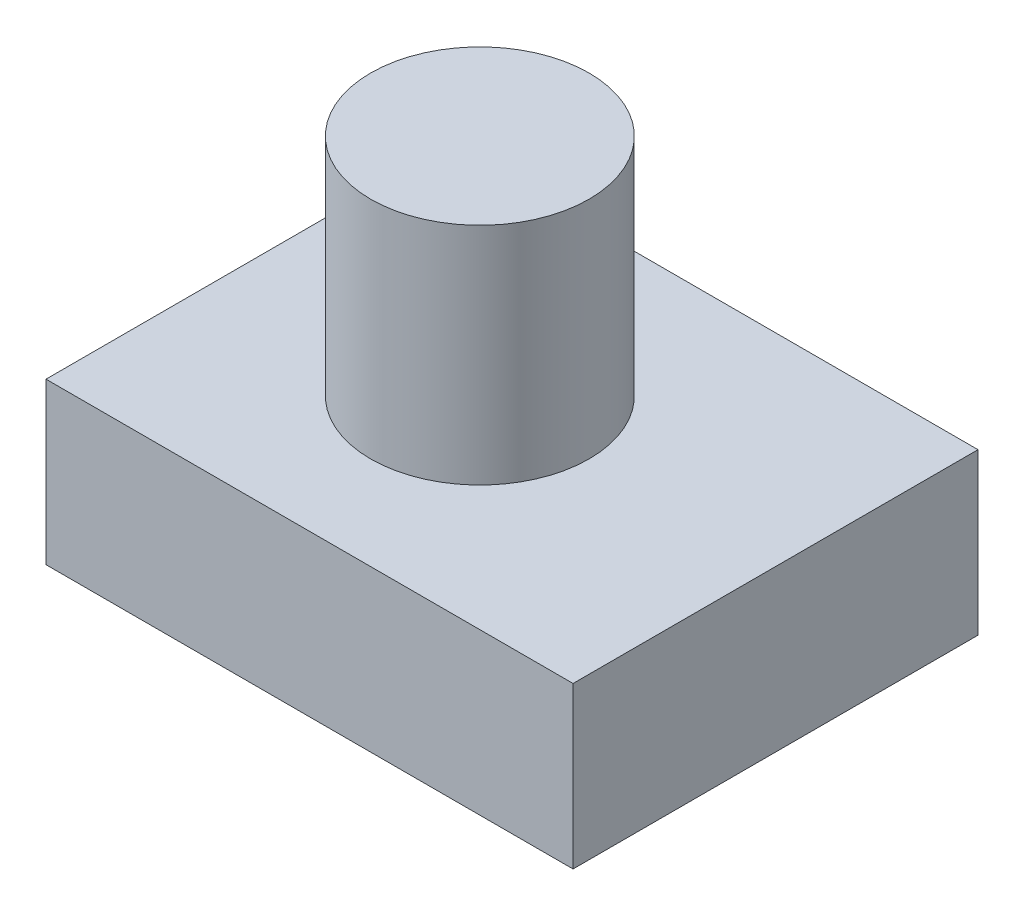
ISO-10303-21;
HEADER;
FILE_DESCRIPTION(('STEP AP214'),'2;1');
FILE_NAME('part.step','',(''),(''),'','','');
FILE_SCHEMA(('AUTOMOTIVE_DESIGN { 1 0 10303 214 1 1 1 1 }'));
ENDSEC;
DATA;
#1=APPLICATION_CONTEXT('core data for automotive mechanical design processes');
#2=APPLICATION_PROTOCOL_DEFINITION('international standard','automotive_design',2000,#1);
#3=PRODUCT_CONTEXT('',#1,'mechanical');
#4=PRODUCT('Part','Part','',(#3));
#5=PRODUCT_RELATED_PRODUCT_CATEGORY('part','',(#4));
#6=PRODUCT_DEFINITION_FORMATION('','',#4);
#7=PRODUCT_DEFINITION_CONTEXT('part definition',#1,'design');
#8=PRODUCT_DEFINITION('design','',#6,#7);
#9=PRODUCT_DEFINITION_SHAPE('','',#8);
#10=(LENGTH_UNIT() NAMED_UNIT(*) SI_UNIT(.MILLI.,.METRE.));
#11=(NAMED_UNIT(*) PLANE_ANGLE_UNIT() SI_UNIT($,.RADIAN.));
#12=(NAMED_UNIT(*) SI_UNIT($,.STERADIAN.) SOLID_ANGLE_UNIT());
#13=UNCERTAINTY_MEASURE_WITH_UNIT(LENGTH_MEASURE(1.E-05),#10,'distance_accuracy_value','');
#14=(GEOMETRIC_REPRESENTATION_CONTEXT(3) GLOBAL_UNCERTAINTY_ASSIGNED_CONTEXT((#13)) GLOBAL_UNIT_ASSIGNED_CONTEXT((#10,
#11,#12)) REPRESENTATION_CONTEXT('',''));
#15=CARTESIAN_POINT('',(0.,0.,0.));
#16=DIRECTION('',(0.,0.,1.));
#17=DIRECTION('',(1.,0.,0.));
#18=AXIS2_PLACEMENT_3D('',#15,#16,#17);
#19=CARTESIAN_POINT('',(-2.06001319229097,19.0815077251743,10.1379464285714));
#20=DIRECTION('',(1.,0.,0.));
#21=DIRECTION('',(0.,0.,-1.));
#22=AXIS2_PLACEMENT_3D('',#19,#20,#21);
#23=PLANE('',#22);
#24=DIRECTION('',(0.,0.,1.));
#25=VECTOR('',#24,1.);
#26=CARTESIAN_POINT('',(-2.06001319229097,16.5815077251743,10.1379464285714));
#27=LINE('',#26,#25);
#28=CARTESIAN_POINT('',(-2.06001319229097,16.5815077251743,10.1379464285714));
#29=VERTEX_POINT('',#28);
#30=CARTESIAN_POINT('',(-2.06001319229097,16.5815077251743,16.4379464285714));
#31=VERTEX_POINT('',#30);
#32=EDGE_CURVE('E102',#29,#31,#27,.T.);
#33=ORIENTED_EDGE('',*,*,#32,.T.);
#34=DIRECTION('',(0.,-1.,0.));
#35=VECTOR('',#34,1.);
#36=CARTESIAN_POINT('',(-2.06001319229097,19.0815077251743,16.4379464285714));
#37=LINE('',#36,#35);
#38=CARTESIAN_POINT('',(-2.06001319229097,19.0815077251743,16.4379464285714));
#39=VERTEX_POINT('',#38);
#40=EDGE_CURVE('E39',#39,#31,#37,.T.);
#41=ORIENTED_EDGE('',*,*,#40,.F.);
#42=DIRECTION('',(0.,0.,1.));
#43=VECTOR('',#42,1.);
#44=CARTESIAN_POINT('',(-2.06001319229097,19.0815077251743,10.1379464285714));
#45=LINE('',#44,#43);
#46=CARTESIAN_POINT('',(-2.06001319229097,19.0815077251743,10.1379464285714));
#47=VERTEX_POINT('',#46);
#48=EDGE_CURVE('E89',#47,#39,#45,.T.);
#49=ORIENTED_EDGE('',*,*,#48,.F.);
#50=DIRECTION('',(0.,-1.,0.));
#51=VECTOR('',#50,1.);
#52=CARTESIAN_POINT('',(-2.06001319229097,19.0815077251743,10.1379464285714));
#53=LINE('',#52,#51);
#54=EDGE_CURVE('E98',#47,#29,#53,.T.);
#55=ORIENTED_EDGE('',*,*,#54,.T.);
#56=EDGE_LOOP('',(#33,#41,#49,#55));
#57=FACE_BOUND('',#56,.T.);
#58=ADVANCED_FACE('F36',(#57),#23,.F.);
#59=CARTESIAN_POINT('',(-2.06001319229097,19.0815077251743,16.4379464285714));
#60=DIRECTION('',(0.,0.,-1.));
#61=DIRECTION('',(-1.,0.,0.));
#62=AXIS2_PLACEMENT_3D('',#59,#60,#61);
#63=PLANE('',#62);
#64=DIRECTION('',(1.,0.,0.));
#65=VECTOR('',#64,1.);
#66=CARTESIAN_POINT('',(-2.06001319229097,16.5815077251743,16.4379464285714));
#67=LINE('',#66,#65);
#68=CARTESIAN_POINT('',(6.13998680770904,16.5815077251743,16.4379464285714));
#69=VERTEX_POINT('',#68);
#70=EDGE_CURVE('E94',#31,#69,#67,.T.);
#71=ORIENTED_EDGE('',*,*,#70,.T.);
#72=DIRECTION('',(0.,-1.,0.));
#73=VECTOR('',#72,1.);
#74=CARTESIAN_POINT('',(6.13998680770904,19.0815077251743,16.4379464285714));
#75=LINE('',#74,#73);
#76=CARTESIAN_POINT('',(6.13998680770904,19.0815077251743,16.4379464285714));
#77=VERTEX_POINT('',#76);
#78=EDGE_CURVE('E92',#77,#69,#75,.T.);
#79=ORIENTED_EDGE('',*,*,#78,.F.);
#80=DIRECTION('',(1.,0.,0.));
#81=VECTOR('',#80,1.);
#82=CARTESIAN_POINT('',(-2.06001319229097,19.0815077251743,16.4379464285714));
#83=LINE('',#82,#81);
#84=EDGE_CURVE('E84',#39,#77,#83,.T.);
#85=ORIENTED_EDGE('',*,*,#84,.F.);
#86=ORIENTED_EDGE('',*,*,#40,.T.);
#87=EDGE_LOOP('',(#71,#79,#85,#86));
#88=FACE_BOUND('',#87,.T.);
#89=ADVANCED_FACE('F93',(#88),#63,.F.);
#90=CARTESIAN_POINT('',(6.13998680770903,19.0815077251743,10.1379464285714));
#91=DIRECTION('',(-1.,0.,0.));
#92=DIRECTION('',(0.,0.,1.));
#93=AXIS2_PLACEMENT_3D('',#90,#91,#92);
#94=PLANE('',#93);
#95=DIRECTION('',(0.,0.,-1.));
#96=VECTOR('',#95,1.);
#97=CARTESIAN_POINT('',(6.13998680770903,16.5815077251743,10.1379464285714));
#98=LINE('',#97,#96);
#99=CARTESIAN_POINT('',(6.13998680770903,16.5815077251743,10.1379464285714));
#100=VERTEX_POINT('',#99);
#101=EDGE_CURVE('E70',#69,#100,#98,.T.);
#102=ORIENTED_EDGE('',*,*,#101,.T.);
#103=DIRECTION('',(0.,-1.,0.));
#104=VECTOR('',#103,1.);
#105=CARTESIAN_POINT('',(6.13998680770903,19.0815077251743,10.1379464285714));
#106=LINE('',#105,#104);
#107=CARTESIAN_POINT('',(6.13998680770903,19.0815077251743,10.1379464285714));
#108=VERTEX_POINT('',#107);
#109=EDGE_CURVE('E95',#108,#100,#106,.T.);
#110=ORIENTED_EDGE('',*,*,#109,.F.);
#111=DIRECTION('',(0.,0.,-1.));
#112=VECTOR('',#111,1.);
#113=CARTESIAN_POINT('',(6.13998680770903,19.0815077251743,10.1379464285714));
#114=LINE('',#113,#112);
#115=EDGE_CURVE('E87',#77,#108,#114,.T.);
#116=ORIENTED_EDGE('',*,*,#115,.F.);
#117=ORIENTED_EDGE('',*,*,#78,.T.);
#118=EDGE_LOOP('',(#102,#110,#116,#117));
#119=FACE_BOUND('',#118,.T.);
#120=ADVANCED_FACE('F96',(#119),#94,.F.);
#121=CARTESIAN_POINT('',(-2.06001319229097,19.0815077251743,10.1379464285714));
#122=DIRECTION('',(0.,0.,1.));
#123=DIRECTION('',(1.,0.,0.));
#124=AXIS2_PLACEMENT_3D('',#121,#122,#123);
#125=PLANE('',#124);
#126=DIRECTION('',(-1.,0.,0.));
#127=VECTOR('',#126,1.);
#128=CARTESIAN_POINT('',(-2.06001319229097,16.5815077251743,10.1379464285714));
#129=LINE('',#128,#127);
#130=EDGE_CURVE('E76',#100,#29,#129,.T.);
#131=ORIENTED_EDGE('',*,*,#130,.T.);
#132=ORIENTED_EDGE('',*,*,#54,.F.);
#133=DIRECTION('',(-1.,0.,0.));
#134=VECTOR('',#133,1.);
#135=CARTESIAN_POINT('',(-2.06001319229097,19.0815077251743,10.1379464285714));
#136=LINE('',#135,#134);
#137=EDGE_CURVE('E53',#108,#47,#136,.T.);
#138=ORIENTED_EDGE('',*,*,#137,.F.);
#139=ORIENTED_EDGE('',*,*,#109,.T.);
#140=EDGE_LOOP('',(#131,#132,#138,#139));
#141=FACE_BOUND('',#140,.T.);
#142=ADVANCED_FACE('F110',(#141),#125,.F.);
#143=CARTESIAN_POINT('',(1.74712966485189,19.0815077251743,11.9591517857143));
#144=DIRECTION('',(0.,1.,0.));
#145=DIRECTION('',(0.,0.,1.));
#146=AXIS2_PLACEMENT_3D('',#143,#144,#145);
#147=PLANE('',#146);
#148=CARTESIAN_POINT('',(1.53998680770904,19.0815077251743,13.2879464285714));
#149=DIRECTION('',(0.,1.,0.));
#150=DIRECTION('',(0.,0.,1.));
#151=AXIS2_PLACEMENT_3D('',#148,#149,#150);
#152=CIRCLE('',#151,1.7);
#153=CARTESIAN_POINT('',(1.53998680770904,19.0815077251743,14.9879464285714));
#154=VERTEX_POINT('',#153);
#155=EDGE_CURVE('E11',#154,#154,#152,.T.);
#156=ORIENTED_EDGE('',*,*,#155,.F.);
#157=EDGE_LOOP('',(#156));
#158=FACE_BOUND('',#157,.T.);
#159=ORIENTED_EDGE('',*,*,#48,.T.);
#160=ORIENTED_EDGE('',*,*,#84,.T.);
#161=ORIENTED_EDGE('',*,*,#115,.T.);
#162=ORIENTED_EDGE('',*,*,#137,.T.);
#163=EDGE_LOOP('',(#159,#160,#161,#162));
#164=FACE_BOUND('',#163,.T.);
#165=ADVANCED_FACE('F85',(#158,#164),#147,.T.);
#166=CARTESIAN_POINT('',(1.74712966485189,16.5815077251743,11.9591517857143));
#167=DIRECTION('',(0.,1.,0.));
#168=DIRECTION('',(0.,0.,1.));
#169=AXIS2_PLACEMENT_3D('',#166,#167,#168);
#170=PLANE('',#169);
#171=ORIENTED_EDGE('',*,*,#32,.F.);
#172=ORIENTED_EDGE('',*,*,#130,.F.);
#173=ORIENTED_EDGE('',*,*,#101,.F.);
#174=ORIENTED_EDGE('',*,*,#70,.F.);
#175=EDGE_LOOP('',(#171,#172,#173,#174));
#176=FACE_BOUND('',#175,.T.);
#177=ADVANCED_FACE('F113',(#176),#170,.F.);
#178=CARTESIAN_POINT('',(1.53998680770904,22.5815077251743,13.2879464285714));
#179=DIRECTION('',(0.,-1.,0.));
#180=DIRECTION('',(0.,0.,-1.));
#181=AXIS2_PLACEMENT_3D('',#178,#179,#180);
#182=CYLINDRICAL_SURFACE('',#181,1.7);
#183=CARTESIAN_POINT('',(1.53998680770904,22.5815077251743,13.2879464285714));
#184=DIRECTION('',(0.,1.,0.));
#185=DIRECTION('',(0.,0.,1.));
#186=AXIS2_PLACEMENT_3D('',#183,#184,#185);
#187=CIRCLE('',#186,1.7);
#188=CARTESIAN_POINT('',(1.53998680770904,22.5815077251743,14.9879464285714));
#189=VERTEX_POINT('',#188);
#190=EDGE_CURVE('E105',#189,#189,#187,.T.);
#191=ORIENTED_EDGE('',*,*,#190,.F.);
#192=EDGE_LOOP('',(#191));
#193=FACE_BOUND('',#192,.T.);
#194=ORIENTED_EDGE('',*,*,#155,.T.);
#195=EDGE_LOOP('',(#194));
#196=FACE_BOUND('',#195,.T.);
#197=ADVANCED_FACE('F121',(#193,#196),#182,.T.);
#198=CARTESIAN_POINT('',(1.53998680770904,22.5815077251743,13.2879464285714));
#199=DIRECTION('',(0.,1.,0.));
#200=DIRECTION('',(0.,0.,1.));
#201=AXIS2_PLACEMENT_3D('',#198,#199,#200);
#202=PLANE('',#201);
#203=ORIENTED_EDGE('',*,*,#190,.T.);
#204=EDGE_LOOP('',(#203));
#205=FACE_BOUND('',#204,.T.);
#206=ADVANCED_FACE('F119',(#205),#202,.T.);
#207=CLOSED_SHELL('',(#58,#89,#120,#142,#165,#177,#197,#206));
#208=MANIFOLD_SOLID_BREP('B2',#207);
#209=ADVANCED_BREP_SHAPE_REPRESENTATION('',(#18,#208),#14);
#210=SHAPE_DEFINITION_REPRESENTATION(#9,#209);
ENDSEC;
END-ISO-10303-21;
